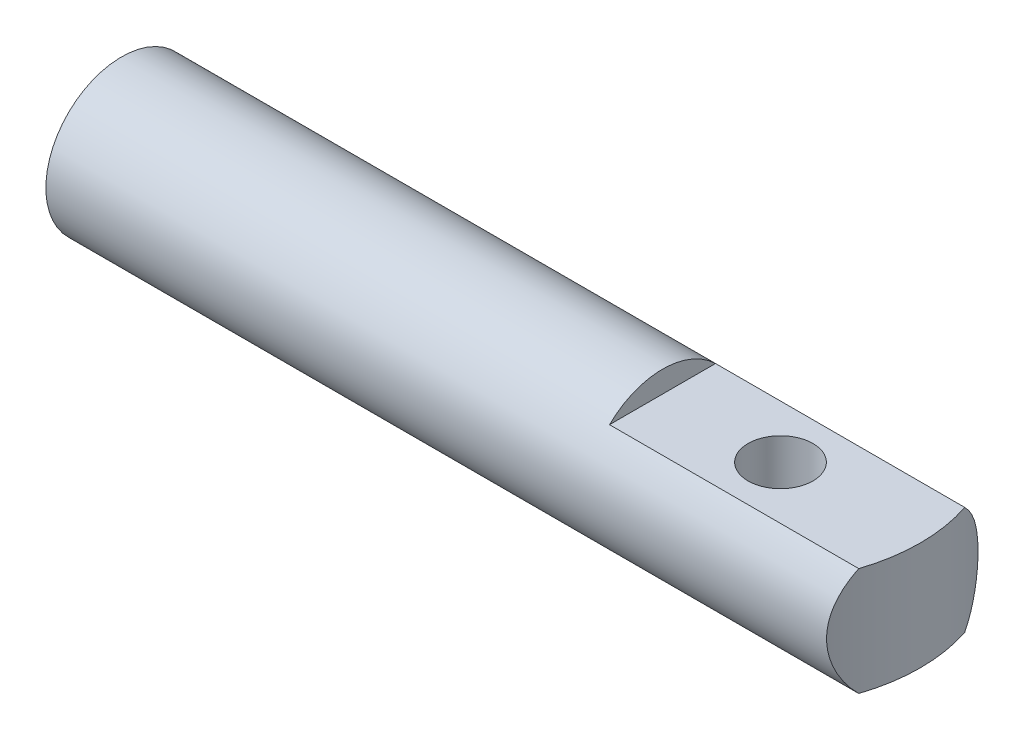
ISO-10303-21;
HEADER;
FILE_DESCRIPTION(('STEP AP214'),'2;1');
FILE_NAME('part.step','',(''),(''),'','','');
FILE_SCHEMA(('AUTOMOTIVE_DESIGN { 1 0 10303 214 1 1 1 1 }'));
ENDSEC;
DATA;
#1=APPLICATION_CONTEXT('core data for automotive mechanical design processes');
#2=APPLICATION_PROTOCOL_DEFINITION('international standard','automotive_design',2000,#1);
#3=PRODUCT_CONTEXT('',#1,'mechanical');
#4=PRODUCT('Part','Part','',(#3));
#5=PRODUCT_RELATED_PRODUCT_CATEGORY('part','',(#4));
#6=PRODUCT_DEFINITION_FORMATION('','',#4);
#7=PRODUCT_DEFINITION_CONTEXT('part definition',#1,'design');
#8=PRODUCT_DEFINITION('design','',#6,#7);
#9=PRODUCT_DEFINITION_SHAPE('','',#8);
#10=(LENGTH_UNIT() NAMED_UNIT(*) SI_UNIT(.MILLI.,.METRE.));
#11=(NAMED_UNIT(*) PLANE_ANGLE_UNIT() SI_UNIT($,.RADIAN.));
#12=(NAMED_UNIT(*) SI_UNIT($,.STERADIAN.) SOLID_ANGLE_UNIT());
#13=UNCERTAINTY_MEASURE_WITH_UNIT(LENGTH_MEASURE(1.E-05),#10,'distance_accuracy_value','');
#14=(GEOMETRIC_REPRESENTATION_CONTEXT(3) GLOBAL_UNCERTAINTY_ASSIGNED_CONTEXT((#13)) GLOBAL_UNIT_ASSIGNED_CONTEXT((#10,
#11,#12)) REPRESENTATION_CONTEXT('',''));
#15=CARTESIAN_POINT('',(0.,0.,0.));
#16=DIRECTION('',(0.,0.,1.));
#17=DIRECTION('',(1.,0.,0.));
#18=AXIS2_PLACEMENT_3D('',#15,#16,#17);
#19=CARTESIAN_POINT('',(131.138201150447,10.,0.));
#20=DIRECTION('',(0.,-1.,0.));
#21=DIRECTION('',(0.,0.,-1.));
#22=AXIS2_PLACEMENT_3D('',#19,#20,#21);
#23=CYLINDRICAL_SURFACE('',#22,31.);
#24=CARTESIAN_POINT('',(160.549083490152,10.,-9.79795897113271));
#25=CARTESIAN_POINT('',(160.502764217688,9.86376765097731,-9.93699812165885));
#26=CARTESIAN_POINT('',(160.45630797724,9.72467686127754,-10.0731580498452));
#27=CARTESIAN_POINT('',(160.363433379192,9.44098377853091,-10.339520662966));
#28=CARTESIAN_POINT('',(160.317015014125,9.29638334049491,-10.4697253210196));
#29=CARTESIAN_POINT('',(160.17821706154,8.85442103510068,-10.8513009448076));
#30=CARTESIAN_POINT('',(160.086315336158,8.54895848613099,-11.0935720146397));
#31=CARTESIAN_POINT('',(159.905965137317,7.91684227939372,-11.553224849167));
#32=CARTESIAN_POINT('',(159.817532932594,7.5901043736881,-11.7704968883442));
#33=CARTESIAN_POINT('',(159.647102260104,6.91830633454597,-12.1774888041409));
#34=CARTESIAN_POINT('',(159.565103242544,6.57324777106,-12.3672110363963));
#35=CARTESIAN_POINT('',(159.409864965617,5.8656981942862,-12.7180959085676));
#36=CARTESIAN_POINT('',(159.336651650223,5.50315977781407,-12.8791746084371));
#37=CARTESIAN_POINT('',(159.201772260002,4.76402462877797,-13.1704880464789));
#38=CARTESIAN_POINT('',(159.140099850022,4.38743574592077,-13.300739716999));
#39=CARTESIAN_POINT('',(159.030603522572,3.62336277492025,-13.5288541609514));
#40=CARTESIAN_POINT('',(158.982754043903,3.23590026948147,-13.6267767654502));
#41=CARTESIAN_POINT('',(158.902618776027,2.4524740294464,-13.7893206563924));
#42=CARTESIAN_POINT('',(158.870331494726,2.05651111366792,-13.8539451354792));
#43=CARTESIAN_POINT('',(158.824327797364,1.28773690865484,-13.9456377623742));
#44=CARTESIAN_POINT('',(158.809458195552,0.915271804782625,-13.9750413914078));
#45=CARTESIAN_POINT('',(158.79483408199,0.168891122499348,-14.0039612846892));
#46=CARTESIAN_POINT('',(158.795078879337,-0.205024388829956,-14.0034789150741));
#47=CARTESIAN_POINT('',(158.810675221176,-0.951336528881177,-13.9726328489313));
#48=CARTESIAN_POINT('',(158.826028404742,-1.32373298840301,-13.9422659102946));
#49=CARTESIAN_POINT('',(158.871280783178,-2.06402735580566,-13.8520335025412));
#50=CARTESIAN_POINT('',(158.901179750584,-2.43192533394065,-13.7921684947096));
#51=CARTESIAN_POINT('',(158.972425301477,-3.14026900406143,-13.6477854307913));
#52=CARTESIAN_POINT('',(159.013045561057,-3.48110608895471,-13.5648176545911));
#53=CARTESIAN_POINT('',(159.10510026114,-4.15435850031108,-13.3739959889474));
#54=CARTESIAN_POINT('',(159.156538334198,-4.4867709557162,-13.2661337389045));
#55=CARTESIAN_POINT('',(159.268790083409,-5.14141184975471,-13.026414557626));
#56=CARTESIAN_POINT('',(159.329609461663,-5.46363395003323,-12.8945430243306));
#57=CARTESIAN_POINT('',(159.458981870371,-6.09610259891087,-12.6078586453285));
#58=CARTESIAN_POINT('',(159.527535387951,-6.4063483915454,-12.4530443544114));
#59=CARTESIAN_POINT('',(159.670934527874,-7.01459728885936,-12.1208893723856));
#60=CARTESIAN_POINT('',(159.745803021958,-7.31254951365501,-11.9434654953218));
#61=CARTESIAN_POINT('',(159.89982470495,-7.89363429360217,-11.5676377119632));
#62=CARTESIAN_POINT('',(159.978976884758,-8.17677030834144,-11.3692387363318));
#63=CARTESIAN_POINT('',(160.139636790346,-8.72652572707023,-10.9529158139361));
#64=CARTESIAN_POINT('',(160.221138785943,-8.99318102577758,-10.7350370248063));
#65=CARTESIAN_POINT('',(160.384939623532,-9.50955160905191,-10.2804069400337));
#66=CARTESIAN_POINT('',(160.467238344348,-9.75926942485049,-10.0436584759337));
#67=CARTESIAN_POINT('',(160.549083490152,-10.,-9.79795897113271));
#68=B_SPLINE_CURVE_WITH_KNOTS('',3,(#24,#25,#26,#27,#28,#29,#30,#31,#32,#33,#34,#35,#36,#37,#38,
#39,#40,#41,#42,#43,#44,#45,#46,#47,#48,#49,#50,#51,#52,#53,#54,#55,#56,#57,#58,#59,#60,#61,#62,
#63,#64,#65,#66,#67),.UNSPECIFIED.,.F.,.F.,(4,2,2,2,2,2,2,2,2,2,2,2,2,2,2,2,2,2,2,2,2,4),(0.,
0.600187767416621,1.20017521644325,2.40041519994813,3.60573704702472,4.81095577274307,
6.01965019383421,7.22767916708113,8.43345975484521,9.63912471014635,10.7594102405181,
11.8796445608756,13.0000004263029,14.120338772379,15.1785829551344,16.2371830587702,
17.2964291497846,18.3557419932198,19.4190713521327,20.4821513052831,21.5428277681699,
22.6033453668089),.UNSPECIFIED.);
#69=CARTESIAN_POINT('',(160.549083490152,10.,-9.79795897113271));
#70=VERTEX_POINT('',#69);
#71=CARTESIAN_POINT('',(160.549083490152,-10.,-9.79795897113271));
#72=VERTEX_POINT('',#71);
#73=EDGE_CURVE('E94',#70,#72,#68,.T.);
#74=ORIENTED_EDGE('',*,*,#73,.F.);
#75=CARTESIAN_POINT('',(131.138201150447,10.,0.));
#76=DIRECTION('',(0.,1.,0.));
#77=DIRECTION('',(0.,0.,1.));
#78=AXIS2_PLACEMENT_3D('',#75,#76,#77);
#79=CIRCLE('',#78,31.);
#80=CARTESIAN_POINT('',(160.549083490152,10.,9.79795897113271));
#81=VERTEX_POINT('',#80);
#82=EDGE_CURVE('E85',#81,#70,#79,.T.);
#83=ORIENTED_EDGE('',*,*,#82,.F.);
#84=CARTESIAN_POINT('',(160.549083490152,-10.,9.79795897113271));
#85=CARTESIAN_POINT('',(160.502764217688,-9.86376765097731,9.93699812165885));
#86=CARTESIAN_POINT('',(160.45630797724,-9.72467686127754,10.0731580498452));
#87=CARTESIAN_POINT('',(160.363433379192,-9.44098377853091,10.339520662966));
#88=CARTESIAN_POINT('',(160.317015014125,-9.29638334049491,10.4697253210196));
#89=CARTESIAN_POINT('',(160.17821706154,-8.85442103510068,10.8513009448076));
#90=CARTESIAN_POINT('',(160.086315336158,-8.54895848613099,11.0935720146397));
#91=CARTESIAN_POINT('',(159.905965137317,-7.91684227939372,11.553224849167));
#92=CARTESIAN_POINT('',(159.817532932594,-7.5901043736881,11.7704968883442));
#93=CARTESIAN_POINT('',(159.647102260104,-6.91830633454597,12.1774888041409));
#94=CARTESIAN_POINT('',(159.565103242544,-6.57324777106,12.3672110363963));
#95=CARTESIAN_POINT('',(159.409864965617,-5.8656981942862,12.7180959085676));
#96=CARTESIAN_POINT('',(159.336651650223,-5.50315977781407,12.8791746084371));
#97=CARTESIAN_POINT('',(159.201772260002,-4.76402462877797,13.1704880464789));
#98=CARTESIAN_POINT('',(159.140099850022,-4.38743574592077,13.300739716999));
#99=CARTESIAN_POINT('',(159.030603522572,-3.62336277492025,13.5288541609514));
#100=CARTESIAN_POINT('',(158.982754043903,-3.23590026948147,13.6267767654502));
#101=CARTESIAN_POINT('',(158.902618776027,-2.4524740294464,13.7893206563924));
#102=CARTESIAN_POINT('',(158.870331494726,-2.05651111366792,13.8539451354792));
#103=CARTESIAN_POINT('',(158.824327797364,-1.28773690865484,13.9456377623742));
#104=CARTESIAN_POINT('',(158.809458195552,-0.915271804782625,13.9750413914078));
#105=CARTESIAN_POINT('',(158.79483408199,-0.168891122499348,14.0039612846892));
#106=CARTESIAN_POINT('',(158.795078879337,0.205024388829956,14.0034789150741));
#107=CARTESIAN_POINT('',(158.810675221176,0.951336528881177,13.9726328489313));
#108=CARTESIAN_POINT('',(158.826028404742,1.32373298840301,13.9422659102946));
#109=CARTESIAN_POINT('',(158.871280783178,2.06402735580566,13.8520335025412));
#110=CARTESIAN_POINT('',(158.901179750584,2.43192533394065,13.7921684947096));
#111=CARTESIAN_POINT('',(158.972425301477,3.14026900406143,13.6477854307913));
#112=CARTESIAN_POINT('',(159.013045561057,3.48110608895471,13.5648176545911));
#113=CARTESIAN_POINT('',(159.10510026114,4.15435850031108,13.3739959889474));
#114=CARTESIAN_POINT('',(159.156538334198,4.4867709557162,13.2661337389045));
#115=CARTESIAN_POINT('',(159.268790083409,5.14141184975471,13.026414557626));
#116=CARTESIAN_POINT('',(159.329609461663,5.46363395003323,12.8945430243306));
#117=CARTESIAN_POINT('',(159.458981870371,6.09610259891087,12.6078586453285));
#118=CARTESIAN_POINT('',(159.527535387951,6.4063483915454,12.4530443544114));
#119=CARTESIAN_POINT('',(159.670934527874,7.01459728885936,12.1208893723856));
#120=CARTESIAN_POINT('',(159.745803021958,7.31254951365501,11.9434654953218));
#121=CARTESIAN_POINT('',(159.89982470495,7.89363429360217,11.5676377119632));
#122=CARTESIAN_POINT('',(159.978976884758,8.17677030834144,11.3692387363318));
#123=CARTESIAN_POINT('',(160.139636790346,8.72652572707023,10.9529158139361));
#124=CARTESIAN_POINT('',(160.221138785943,8.99318102577758,10.7350370248063));
#125=CARTESIAN_POINT('',(160.384939623532,9.50955160905191,10.2804069400337));
#126=CARTESIAN_POINT('',(160.467238344348,9.75926942485049,10.0436584759337));
#127=CARTESIAN_POINT('',(160.549083490152,10.,9.79795897113271));
#128=B_SPLINE_CURVE_WITH_KNOTS('',3,(#84,#85,#86,#87,#88,#89,#90,#91,#92,#93,#94,#95,#96,#97,
#98,#99,#100,#101,#102,#103,#104,#105,#106,#107,#108,#109,#110,#111,#112,#113,#114,#115,#116,
#117,#118,#119,#120,#121,#122,#123,#124,#125,#126,#127),.UNSPECIFIED.,.F.,.F.,(4,2,2,2,2,2,2,2,
2,2,2,2,2,2,2,2,2,2,2,2,2,4),(0.,0.600187767416621,1.20017521644325,2.40041519994813,
3.60573704702472,4.81095577274307,6.01965019383421,7.22767916708113,8.43345975484521,
9.63912471014635,10.7594102405181,11.8796445608756,13.0000004263029,14.120338772379,
15.1785829551344,16.2371830587702,17.2964291497846,18.3557419932198,19.4190713521327,
20.4821513052831,21.5428277681699,22.6033453668089),.UNSPECIFIED.);
#129=CARTESIAN_POINT('',(160.549083490152,-10.,9.79795897113271));
#130=VERTEX_POINT('',#129);
#131=EDGE_CURVE('E74',#130,#81,#128,.T.);
#132=ORIENTED_EDGE('',*,*,#131,.F.);
#133=CARTESIAN_POINT('',(131.138201150447,-10.,0.));
#134=DIRECTION('',(0.,1.,0.));
#135=DIRECTION('',(0.,0.,1.));
#136=AXIS2_PLACEMENT_3D('',#133,#134,#135);
#137=CIRCLE('',#136,31.);
#138=EDGE_CURVE('E83',#130,#72,#137,.T.);
#139=ORIENTED_EDGE('',*,*,#138,.T.);
#140=EDGE_LOOP('',(#74,#83,#132,#139));
#141=FACE_BOUND('',#140,.T.);
#142=ADVANCED_FACE('F34',(#141),#23,.T.);
#143=CARTESIAN_POINT('',(131.138201150447,10.,0.));
#144=DIRECTION('',(0.,1.,0.));
#145=DIRECTION('',(0.,0.,1.));
#146=AXIS2_PLACEMENT_3D('',#143,#144,#145);
#147=PLANE('',#146);
#148=CARTESIAN_POINT('',(136.284742260621,10.,0.));
#149=DIRECTION('',(0.,1.,0.));
#150=DIRECTION('',(0.,0.,1.));
#151=AXIS2_PLACEMENT_3D('',#148,#149,#150);
#152=CIRCLE('',#151,6.00000000000002);
#153=CARTESIAN_POINT('',(136.284742260621,10.,6.00000000000002));
#154=VERTEX_POINT('',#153);
#155=EDGE_CURVE('E87',#154,#154,#152,.T.);
#156=ORIENTED_EDGE('',*,*,#155,.F.);
#157=EDGE_LOOP('',(#156));
#158=FACE_BOUND('',#157,.T.);
#159=ORIENTED_EDGE('',*,*,#82,.T.);
#160=DIRECTION('',(-1.,0.,0.));
#161=VECTOR('',#160,1.);
#162=CARTESIAN_POINT('',(162.138201150447,10.,-9.79795897113271));
#163=LINE('',#162,#161);
#164=CARTESIAN_POINT('',(114.475,10.,-9.79795897113271));
#165=VERTEX_POINT('',#164);
#166=EDGE_CURVE('E90',#70,#165,#163,.T.);
#167=ORIENTED_EDGE('',*,*,#166,.T.);
#168=DIRECTION('',(0.,0.,1.));
#169=VECTOR('',#168,1.);
#170=CARTESIAN_POINT('',(114.475,10.,-12.));
#171=LINE('',#170,#169);
#172=CARTESIAN_POINT('',(114.475,10.,9.79795897113271));
#173=VERTEX_POINT('',#172);
#174=EDGE_CURVE('E99',#165,#173,#171,.T.);
#175=ORIENTED_EDGE('',*,*,#174,.T.);
#176=DIRECTION('',(-1.,0.,0.));
#177=VECTOR('',#176,1.);
#178=CARTESIAN_POINT('',(162.138201150447,10.,9.79795897113271));
#179=LINE('',#178,#177);
#180=EDGE_CURVE('E86',#173,#81,#179,.F.);
#181=ORIENTED_EDGE('',*,*,#180,.T.);
#182=EDGE_LOOP('',(#159,#167,#175,#181));
#183=FACE_BOUND('',#182,.T.);
#184=ADVANCED_FACE('F118',(#158,#183),#147,.T.);
#185=CARTESIAN_POINT('',(131.138201150447,-10.,0.));
#186=DIRECTION('',(0.,1.,0.));
#187=DIRECTION('',(0.,0.,1.));
#188=AXIS2_PLACEMENT_3D('',#185,#186,#187);
#189=PLANE('',#188);
#190=CARTESIAN_POINT('',(136.284742260621,-10.,0.));
#191=DIRECTION('',(0.,-1.,0.));
#192=DIRECTION('',(0.,0.,-1.));
#193=AXIS2_PLACEMENT_3D('',#190,#191,#192);
#194=CIRCLE('',#193,6.00000000000002);
#195=CARTESIAN_POINT('',(136.284742260621,-10.,-6.00000000000002));
#196=VERTEX_POINT('',#195);
#197=EDGE_CURVE('E176',#196,#196,#194,.T.);
#198=ORIENTED_EDGE('',*,*,#197,.F.);
#199=EDGE_LOOP('',(#198));
#200=FACE_BOUND('',#199,.T.);
#201=DIRECTION('',(-1.,0.,0.));
#202=VECTOR('',#201,1.);
#203=CARTESIAN_POINT('',(162.138201150447,-10.,-9.79795897113271));
#204=LINE('',#203,#202);
#205=CARTESIAN_POINT('',(114.475,-10.,-9.79795897113271));
#206=VERTEX_POINT('',#205);
#207=EDGE_CURVE('E12',#72,#206,#204,.T.);
#208=ORIENTED_EDGE('',*,*,#207,.F.);
#209=ORIENTED_EDGE('',*,*,#138,.F.);
#210=DIRECTION('',(-1.,0.,0.));
#211=VECTOR('',#210,1.);
#212=CARTESIAN_POINT('',(162.138201150447,-10.,9.79795897113271));
#213=LINE('',#212,#211);
#214=CARTESIAN_POINT('',(114.475,-10.,9.79795897113272));
#215=VERTEX_POINT('',#214);
#216=EDGE_CURVE('E42',#215,#130,#213,.F.);
#217=ORIENTED_EDGE('',*,*,#216,.F.);
#218=DIRECTION('',(0.,0.,1.));
#219=VECTOR('',#218,1.);
#220=CARTESIAN_POINT('',(114.475,-10.,-12.));
#221=LINE('',#220,#219);
#222=EDGE_CURVE('E92',#206,#215,#221,.T.);
#223=ORIENTED_EDGE('',*,*,#222,.F.);
#224=EDGE_LOOP('',(#208,#209,#217,#223));
#225=FACE_BOUND('',#224,.T.);
#226=ADVANCED_FACE('F89',(#200,#225),#189,.F.);
#227=CARTESIAN_POINT('',(114.475,0.,-12.));
#228=DIRECTION('',(1.,0.,0.));
#229=DIRECTION('',(0.,0.,-1.));
#230=AXIS2_PLACEMENT_3D('',#227,#228,#229);
#231=PLANE('',#230);
#232=CARTESIAN_POINT('',(114.475,0.,0.));
#233=DIRECTION('',(1.,0.,0.));
#234=DIRECTION('',(0.,0.,-1.));
#235=AXIS2_PLACEMENT_3D('',#232,#233,#234);
#236=CIRCLE('',#235,14.);
#237=EDGE_CURVE('E77',#215,#206,#236,.T.);
#238=ORIENTED_EDGE('',*,*,#237,.T.);
#239=ORIENTED_EDGE('',*,*,#222,.T.);
#240=EDGE_LOOP('',(#238,#239));
#241=FACE_BOUND('',#240,.T.);
#242=ADVANCED_FACE('F112',(#241),#231,.T.);
#243=ORIENTED_EDGE('',*,*,#174,.F.);
#244=EDGE_CURVE('E78',#165,#173,#236,.T.);
#245=ORIENTED_EDGE('',*,*,#244,.T.);
#246=EDGE_LOOP('',(#243,#245));
#247=FACE_BOUND('',#246,.T.);
#248=ADVANCED_FACE('F36',(#247),#231,.T.);
#249=CARTESIAN_POINT('',(134.425,0.,0.));
#250=DIRECTION('',(1.,0.,0.));
#251=DIRECTION('',(0.,0.,-1.));
#252=AXIS2_PLACEMENT_3D('',#249,#250,#251);
#253=CYLINDRICAL_SURFACE('',#252,14.);
#254=ORIENTED_EDGE('',*,*,#244,.F.);
#255=ORIENTED_EDGE('',*,*,#166,.F.);
#256=ORIENTED_EDGE('',*,*,#73,.T.);
#257=ORIENTED_EDGE('',*,*,#207,.T.);
#258=ORIENTED_EDGE('',*,*,#237,.F.);
#259=ORIENTED_EDGE('',*,*,#216,.T.);
#260=ORIENTED_EDGE('',*,*,#131,.T.);
#261=ORIENTED_EDGE('',*,*,#180,.F.);
#262=EDGE_LOOP('',(#254,#255,#256,#257,#258,#259,#260,#261));
#263=FACE_BOUND('',#262,.T.);
#264=CARTESIAN_POINT('',(14.475,0.,0.));
#265=DIRECTION('',(1.,0.,0.));
#266=DIRECTION('',(0.,0.,-1.));
#267=AXIS2_PLACEMENT_3D('',#264,#265,#266);
#268=CIRCLE('',#267,14.);
#269=CARTESIAN_POINT('',(14.475,0.,-14.));
#270=VERTEX_POINT('',#269);
#271=EDGE_CURVE('E105',#270,#270,#268,.T.);
#272=ORIENTED_EDGE('',*,*,#271,.T.);
#273=EDGE_LOOP('',(#272));
#274=FACE_BOUND('',#273,.T.);
#275=ADVANCED_FACE('F72',(#263,#274),#253,.T.);
#276=CARTESIAN_POINT('',(14.475,0.,-12.));
#277=DIRECTION('',(-1.,0.,0.));
#278=DIRECTION('',(0.,0.,1.));
#279=AXIS2_PLACEMENT_3D('',#276,#277,#278);
#280=PLANE('',#279);
#281=ORIENTED_EDGE('',*,*,#271,.F.);
#282=EDGE_LOOP('',(#281));
#283=FACE_BOUND('',#282,.T.);
#284=CARTESIAN_POINT('',(14.475,0.,0.));
#285=DIRECTION('',(-1.,0.,0.));
#286=DIRECTION('',(0.,0.,1.));
#287=AXIS2_PLACEMENT_3D('',#284,#285,#286);
#288=CIRCLE('',#287,8.);
#289=CARTESIAN_POINT('',(14.475,0.,8.));
#290=VERTEX_POINT('',#289);
#291=EDGE_CURVE('E169',#290,#290,#288,.T.);
#292=ORIENTED_EDGE('',*,*,#291,.F.);
#293=EDGE_LOOP('',(#292));
#294=FACE_BOUND('',#293,.T.);
#295=ADVANCED_FACE('F150',(#283,#294),#280,.T.);
#296=CARTESIAN_POINT('',(136.284742260621,14.,0.));
#297=DIRECTION('',(0.,-1.,0.));
#298=DIRECTION('',(0.,0.,-1.));
#299=AXIS2_PLACEMENT_3D('',#296,#297,#298);
#300=CYLINDRICAL_SURFACE('',#299,6.00000000000002);
#301=ORIENTED_EDGE('',*,*,#155,.T.);
#302=EDGE_LOOP('',(#301));
#303=FACE_BOUND('',#302,.T.);
#304=ORIENTED_EDGE('',*,*,#197,.T.);
#305=EDGE_LOOP('',(#304));
#306=FACE_BOUND('',#305,.T.);
#307=ADVANCED_FACE('F145',(#303,#306),#300,.F.);
#308=CARTESIAN_POINT('',(16.475,0.,0.));
#309=DIRECTION('',(-1.,0.,0.));
#310=DIRECTION('',(0.,0.,1.));
#311=AXIS2_PLACEMENT_3D('',#308,#309,#310);
#312=PLANE('',#311);
#313=CARTESIAN_POINT('',(16.475,0.,0.));
#314=DIRECTION('',(-1.,0.,0.));
#315=DIRECTION('',(0.,0.,1.));
#316=AXIS2_PLACEMENT_3D('',#313,#314,#315);
#317=CIRCLE('',#316,8.);
#318=CARTESIAN_POINT('',(16.475,0.,8.));
#319=VERTEX_POINT('',#318);
#320=EDGE_CURVE('E166',#319,#319,#317,.T.);
#321=ORIENTED_EDGE('',*,*,#320,.T.);
#322=EDGE_LOOP('',(#321));
#323=FACE_BOUND('',#322,.T.);
#324=CARTESIAN_POINT('',(16.475,0.,0.));
#325=DIRECTION('',(-1.,0.,0.));
#326=DIRECTION('',(0.,0.,1.));
#327=AXIS2_PLACEMENT_3D('',#324,#325,#326);
#328=CIRCLE('',#327,12.);
#329=CARTESIAN_POINT('',(16.475,0.,12.));
#330=VERTEX_POINT('',#329);
#331=EDGE_CURVE('E172',#330,#330,#328,.T.);
#332=ORIENTED_EDGE('',*,*,#331,.F.);
#333=EDGE_LOOP('',(#332));
#334=FACE_BOUND('',#333,.T.);
#335=ADVANCED_FACE('F149',(#323,#334),#312,.F.);
#336=CARTESIAN_POINT('',(16.475,0.,0.));
#337=DIRECTION('',(-1.,0.,0.));
#338=DIRECTION('',(0.,0.,1.));
#339=AXIS2_PLACEMENT_3D('',#336,#337,#338);
#340=CYLINDRICAL_SURFACE('',#339,8.);
#341=ORIENTED_EDGE('',*,*,#320,.F.);
#342=EDGE_LOOP('',(#341));
#343=FACE_BOUND('',#342,.T.);
#344=ORIENTED_EDGE('',*,*,#291,.T.);
#345=EDGE_LOOP('',(#344));
#346=FACE_BOUND('',#345,.T.);
#347=ADVANCED_FACE('F154',(#343,#346),#340,.F.);
#348=CARTESIAN_POINT('',(98.475,0.,0.));
#349=DIRECTION('',(1.,0.,0.));
#350=DIRECTION('',(0.,0.,-1.));
#351=AXIS2_PLACEMENT_3D('',#348,#349,#350);
#352=PLANE('',#351);
#353=CARTESIAN_POINT('',(98.475,0.,0.));
#354=DIRECTION('',(1.,0.,0.));
#355=DIRECTION('',(0.,0.,-1.));
#356=AXIS2_PLACEMENT_3D('',#353,#354,#355);
#357=CIRCLE('',#356,12.);
#358=CARTESIAN_POINT('',(98.475,0.,-12.));
#359=VERTEX_POINT('',#358);
#360=EDGE_CURVE('E102',#359,#359,#357,.T.);
#361=ORIENTED_EDGE('',*,*,#360,.F.);
#362=EDGE_LOOP('',(#361));
#363=FACE_BOUND('',#362,.T.);
#364=ADVANCED_FACE('F130',(#363),#352,.F.);
#365=CARTESIAN_POINT('',(134.425,0.,0.));
#366=DIRECTION('',(1.,0.,0.));
#367=DIRECTION('',(0.,0.,-1.));
#368=AXIS2_PLACEMENT_3D('',#365,#366,#367);
#369=CYLINDRICAL_SURFACE('',#368,12.);
#370=ORIENTED_EDGE('',*,*,#360,.T.);
#371=EDGE_LOOP('',(#370));
#372=FACE_BOUND('',#371,.T.);
#373=ORIENTED_EDGE('',*,*,#331,.T.);
#374=EDGE_LOOP('',(#373));
#375=FACE_BOUND('',#374,.T.);
#376=ADVANCED_FACE('F161',(#372,#375),#369,.F.);
#377=CLOSED_SHELL('',(#142,#184,#226,#242,#248,#275,#295,#307,#335,#347,#364,#376));
#378=MANIFOLD_SOLID_BREP('B2',#377);
#379=ADVANCED_BREP_SHAPE_REPRESENTATION('',(#18,#378),#14);
#380=SHAPE_DEFINITION_REPRESENTATION(#9,#379);
ENDSEC;
END-ISO-10303-21;
